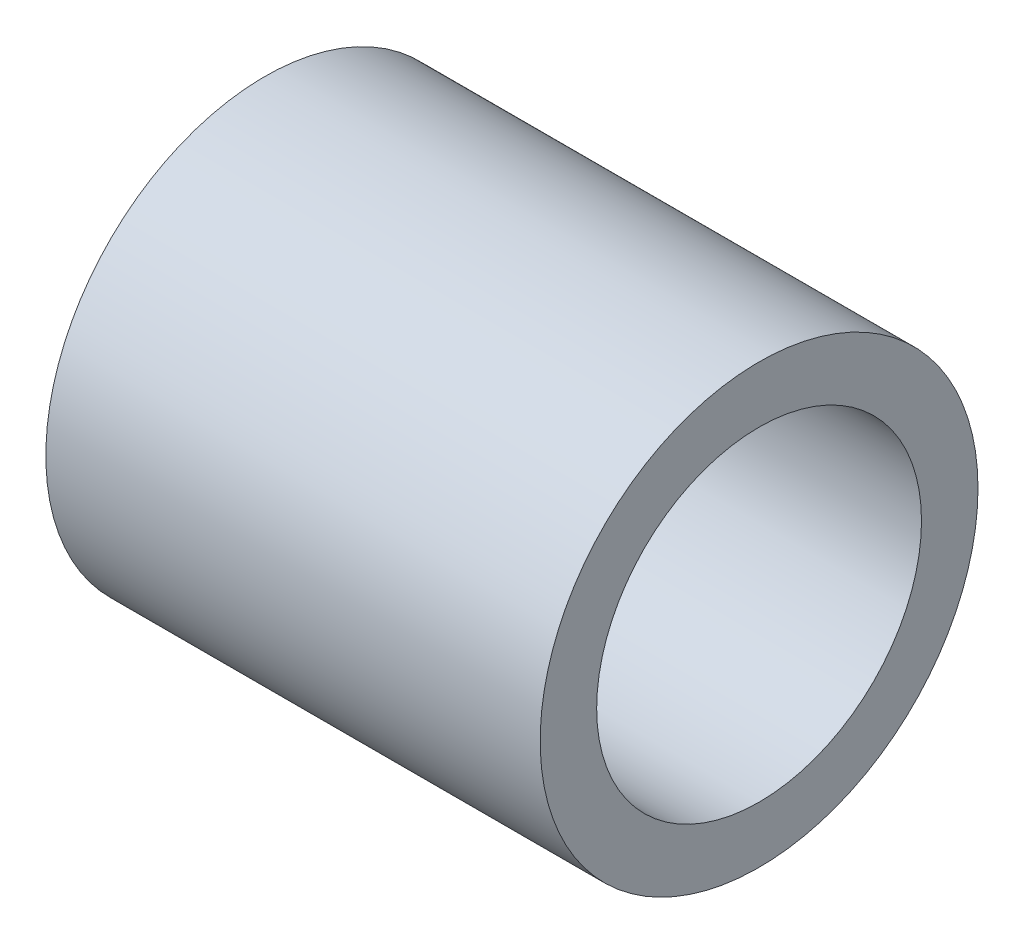
ISO-10303-21;
HEADER;
FILE_DESCRIPTION(('STEP AP214'),'2;1');
FILE_NAME('part.step','',(''),(''),'','','');
FILE_SCHEMA(('AUTOMOTIVE_DESIGN { 1 0 10303 214 1 1 1 1 }'));
ENDSEC;
DATA;
#1=APPLICATION_CONTEXT('core data for automotive mechanical design processes');
#2=APPLICATION_PROTOCOL_DEFINITION('international standard','automotive_design',2000,#1);
#3=PRODUCT_CONTEXT('',#1,'mechanical');
#4=PRODUCT('Part','Part','',(#3));
#5=PRODUCT_RELATED_PRODUCT_CATEGORY('part','',(#4));
#6=PRODUCT_DEFINITION_FORMATION('','',#4);
#7=PRODUCT_DEFINITION_CONTEXT('part definition',#1,'design');
#8=PRODUCT_DEFINITION('design','',#6,#7);
#9=PRODUCT_DEFINITION_SHAPE('','',#8);
#10=(LENGTH_UNIT() NAMED_UNIT(*) SI_UNIT(.MILLI.,.METRE.));
#11=(NAMED_UNIT(*) PLANE_ANGLE_UNIT() SI_UNIT($,.RADIAN.));
#12=(NAMED_UNIT(*) SI_UNIT($,.STERADIAN.) SOLID_ANGLE_UNIT());
#13=UNCERTAINTY_MEASURE_WITH_UNIT(LENGTH_MEASURE(1.E-05),#10,'distance_accuracy_value','');
#14=(GEOMETRIC_REPRESENTATION_CONTEXT(3) GLOBAL_UNCERTAINTY_ASSIGNED_CONTEXT((#13)) GLOBAL_UNIT_ASSIGNED_CONTEXT((#10,
#11,#12)) REPRESENTATION_CONTEXT('',''));
#15=CARTESIAN_POINT('',(0.,0.,0.));
#16=DIRECTION('',(0.,0.,1.));
#17=DIRECTION('',(1.,0.,0.));
#18=AXIS2_PLACEMENT_3D('',#15,#16,#17);
#19=CARTESIAN_POINT('',(22.225,0.,0.));
#20=DIRECTION('',(1.,0.,0.));
#21=DIRECTION('',(0.,0.,-1.));
#22=AXIS2_PLACEMENT_3D('',#19,#20,#21);
#23=PLANE('',#22);
#24=CARTESIAN_POINT('',(22.225,0.,0.));
#25=DIRECTION('',(1.,0.,0.));
#26=DIRECTION('',(0.,0.,-1.));
#27=AXIS2_PLACEMENT_3D('',#24,#25,#26);
#28=CIRCLE('',#27,9.8425);
#29=CARTESIAN_POINT('',(22.225,0.,-9.8425));
#30=VERTEX_POINT('',#29);
#31=EDGE_CURVE('E10',#30,#30,#28,.T.);
#32=ORIENTED_EDGE('',*,*,#31,.T.);
#33=EDGE_LOOP('',(#32));
#34=FACE_BOUND('',#33,.T.);
#35=CARTESIAN_POINT('',(22.225,0.,0.));
#36=DIRECTION('',(1.,0.,0.));
#37=DIRECTION('',(0.,0.,-1.));
#38=AXIS2_PLACEMENT_3D('',#35,#36,#37);
#39=CIRCLE('',#38,7.3025);
#40=CARTESIAN_POINT('',(22.225,0.,-7.3025));
#41=VERTEX_POINT('',#40);
#42=EDGE_CURVE('E56',#41,#41,#39,.T.);
#43=ORIENTED_EDGE('',*,*,#42,.F.);
#44=EDGE_LOOP('',(#43));
#45=FACE_BOUND('',#44,.T.);
#46=ADVANCED_FACE('F43',(#34,#45),#23,.T.);
#47=CARTESIAN_POINT('',(0.,0.,0.));
#48=DIRECTION('',(1.,0.,0.));
#49=DIRECTION('',(0.,0.,-1.));
#50=AXIS2_PLACEMENT_3D('',#47,#48,#49);
#51=PLANE('',#50);
#52=CARTESIAN_POINT('',(0.,0.,0.));
#53=DIRECTION('',(1.,0.,0.));
#54=DIRECTION('',(0.,0.,-1.));
#55=AXIS2_PLACEMENT_3D('',#52,#53,#54);
#56=CIRCLE('',#55,9.8425);
#57=CARTESIAN_POINT('',(0.,0.,-9.8425));
#58=VERTEX_POINT('',#57);
#59=EDGE_CURVE('E47',#58,#58,#56,.T.);
#60=ORIENTED_EDGE('',*,*,#59,.F.);
#61=EDGE_LOOP('',(#60));
#62=FACE_BOUND('',#61,.T.);
#63=CARTESIAN_POINT('',(0.,0.,0.));
#64=DIRECTION('',(1.,0.,0.));
#65=DIRECTION('',(0.,0.,-1.));
#66=AXIS2_PLACEMENT_3D('',#63,#64,#65);
#67=CIRCLE('',#66,7.3025);
#68=CARTESIAN_POINT('',(0.,0.,-7.3025));
#69=VERTEX_POINT('',#68);
#70=EDGE_CURVE('E58',#69,#69,#67,.T.);
#71=ORIENTED_EDGE('',*,*,#70,.T.);
#72=EDGE_LOOP('',(#71));
#73=FACE_BOUND('',#72,.T.);
#74=ADVANCED_FACE('F70',(#62,#73),#51,.F.);
#75=CARTESIAN_POINT('',(22.225,0.,0.));
#76=DIRECTION('',(-1.,0.,0.));
#77=DIRECTION('',(0.,0.,1.));
#78=AXIS2_PLACEMENT_3D('',#75,#76,#77);
#79=CYLINDRICAL_SURFACE('',#78,9.8425);
#80=ORIENTED_EDGE('',*,*,#31,.F.);
#81=EDGE_LOOP('',(#80));
#82=FACE_BOUND('',#81,.T.);
#83=ORIENTED_EDGE('',*,*,#59,.T.);
#84=EDGE_LOOP('',(#83));
#85=FACE_BOUND('',#84,.T.);
#86=ADVANCED_FACE('F45',(#82,#85),#79,.T.);
#87=CARTESIAN_POINT('',(22.225,0.,0.));
#88=DIRECTION('',(-1.,0.,0.));
#89=DIRECTION('',(0.,0.,1.));
#90=AXIS2_PLACEMENT_3D('',#87,#88,#89);
#91=CYLINDRICAL_SURFACE('',#90,7.3025);
#92=ORIENTED_EDGE('',*,*,#42,.T.);
#93=EDGE_LOOP('',(#92));
#94=FACE_BOUND('',#93,.T.);
#95=ORIENTED_EDGE('',*,*,#70,.F.);
#96=EDGE_LOOP('',(#95));
#97=FACE_BOUND('',#96,.T.);
#98=ADVANCED_FACE('F66',(#94,#97),#91,.F.);
#99=CLOSED_SHELL('',(#46,#74,#86,#98));
#100=MANIFOLD_SOLID_BREP('B2',#99);
#101=ADVANCED_BREP_SHAPE_REPRESENTATION('',(#18,#100),#14);
#102=SHAPE_DEFINITION_REPRESENTATION(#9,#101);
ENDSEC;
END-ISO-10303-21;
